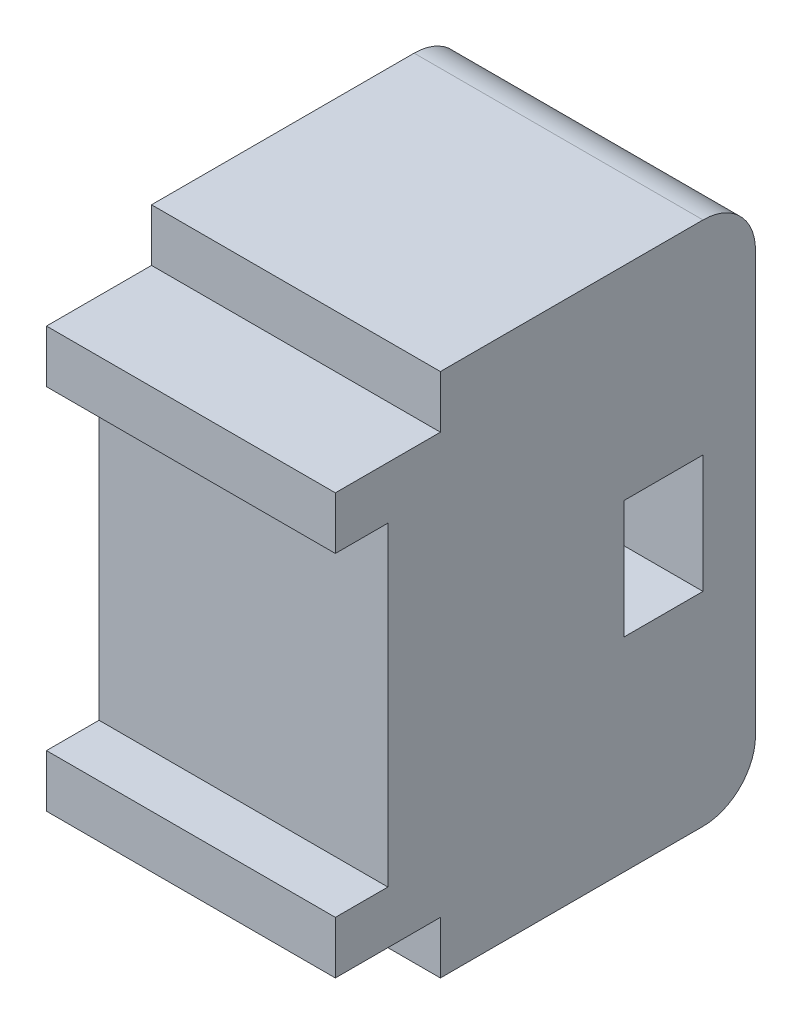
ISO-10303-21;
HEADER;
FILE_DESCRIPTION(('STEP AP214'),'2;1');
FILE_NAME('part.step','',(''),(''),'','','');
FILE_SCHEMA(('AUTOMOTIVE_DESIGN { 1 0 10303 214 1 1 1 1 }'));
ENDSEC;
DATA;
#1=APPLICATION_CONTEXT('core data for automotive mechanical design processes');
#2=APPLICATION_PROTOCOL_DEFINITION('international standard','automotive_design',2000,#1);
#3=PRODUCT_CONTEXT('',#1,'mechanical');
#4=PRODUCT('Part','Part','',(#3));
#5=PRODUCT_RELATED_PRODUCT_CATEGORY('part','',(#4));
#6=PRODUCT_DEFINITION_FORMATION('','',#4);
#7=PRODUCT_DEFINITION_CONTEXT('part definition',#1,'design');
#8=PRODUCT_DEFINITION('design','',#6,#7);
#9=PRODUCT_DEFINITION_SHAPE('','',#8);
#10=(LENGTH_UNIT() NAMED_UNIT(*) SI_UNIT(.MILLI.,.METRE.));
#11=(NAMED_UNIT(*) PLANE_ANGLE_UNIT() SI_UNIT($,.RADIAN.));
#12=(NAMED_UNIT(*) SI_UNIT($,.STERADIAN.) SOLID_ANGLE_UNIT());
#13=UNCERTAINTY_MEASURE_WITH_UNIT(LENGTH_MEASURE(1.E-05),#10,'distance_accuracy_value','');
#14=(GEOMETRIC_REPRESENTATION_CONTEXT(3) GLOBAL_UNCERTAINTY_ASSIGNED_CONTEXT((#13)) GLOBAL_UNIT_ASSIGNED_CONTEXT((#10,
#11,#12)) REPRESENTATION_CONTEXT('',''));
#15=CARTESIAN_POINT('',(0.,0.,0.));
#16=DIRECTION('',(0.,0.,1.));
#17=DIRECTION('',(1.,0.,0.));
#18=AXIS2_PLACEMENT_3D('',#15,#16,#17);
#19=CARTESIAN_POINT('',(11.,0.,0.));
#20=DIRECTION('',(1.,0.,0.));
#21=DIRECTION('',(0.,0.,-1.));
#22=AXIS2_PLACEMENT_3D('',#19,#20,#21);
#23=PLANE('',#22);
#24=DIRECTION('',(0.,1.,0.));
#25=VECTOR('',#24,1.);
#26=CARTESIAN_POINT('',(11.,-10.,-6.));
#27=LINE('',#26,#25);
#28=CARTESIAN_POINT('',(11.,-8.,-6.));
#29=VERTEX_POINT('',#28);
#30=CARTESIAN_POINT('',(11.,8.,-6.));
#31=VERTEX_POINT('',#30);
#32=EDGE_CURVE('E283',#29,#31,#27,.T.);
#33=ORIENTED_EDGE('',*,*,#32,.T.);
#34=CARTESIAN_POINT('',(11.,8.,-4.));
#35=DIRECTION('',(1.,0.,0.));
#36=DIRECTION('',(0.,0.,-1.));
#37=AXIS2_PLACEMENT_3D('',#34,#35,#36);
#38=CIRCLE('',#37,2.);
#39=CARTESIAN_POINT('',(11.,10.,-4.));
#40=VERTEX_POINT('',#39);
#41=EDGE_CURVE('E57',#31,#40,#38,.T.);
#42=ORIENTED_EDGE('',*,*,#41,.T.);
#43=DIRECTION('',(0.,0.,1.));
#44=VECTOR('',#43,1.);
#45=CARTESIAN_POINT('',(11.,10.,6.));
#46=LINE('',#45,#44);
#47=CARTESIAN_POINT('',(11.,10.,6.));
#48=VERTEX_POINT('',#47);
#49=EDGE_CURVE('E273',#40,#48,#46,.T.);
#50=ORIENTED_EDGE('',*,*,#49,.T.);
#51=DIRECTION('',(0.,-1.,0.));
#52=VECTOR('',#51,1.);
#53=CARTESIAN_POINT('',(11.,-10.,6.));
#54=LINE('',#53,#52);
#55=CARTESIAN_POINT('',(11.,8.,6.));
#56=VERTEX_POINT('',#55);
#57=EDGE_CURVE('E277',#48,#56,#54,.T.);
#58=ORIENTED_EDGE('',*,*,#57,.T.);
#59=DIRECTION('',(0.,0.,-1.));
#60=VECTOR('',#59,1.);
#61=CARTESIAN_POINT('',(11.,8.,7.99999999999998));
#62=LINE('',#61,#60);
#63=CARTESIAN_POINT('',(11.,8.,9.99999999999998));
#64=VERTEX_POINT('',#63);
#65=EDGE_CURVE('E260',#64,#56,#62,.T.);
#66=ORIENTED_EDGE('',*,*,#65,.F.);
#67=DIRECTION('',(0.,1.,0.));
#68=VECTOR('',#67,1.);
#69=CARTESIAN_POINT('',(11.,8.,9.99999999999998));
#70=LINE('',#69,#68);
#71=CARTESIAN_POINT('',(11.,6.,9.99999999999998));
#72=VERTEX_POINT('',#71);
#73=EDGE_CURVE('E182',#72,#64,#70,.T.);
#74=ORIENTED_EDGE('',*,*,#73,.F.);
#75=DIRECTION('',(0.,0.,-1.));
#76=VECTOR('',#75,1.);
#77=CARTESIAN_POINT('',(11.,6.,9.99999999999998));
#78=LINE('',#77,#76);
#79=CARTESIAN_POINT('',(11.,6.,7.99999999999998));
#80=VERTEX_POINT('',#79);
#81=EDGE_CURVE('E178',#72,#80,#78,.T.);
#82=ORIENTED_EDGE('',*,*,#81,.T.);
#83=DIRECTION('',(0.,1.,0.));
#84=VECTOR('',#83,1.);
#85=CARTESIAN_POINT('',(11.,-8.,7.99999999999998));
#86=LINE('',#85,#84);
#87=CARTESIAN_POINT('',(11.,-6.,7.99999999999998));
#88=VERTEX_POINT('',#87);
#89=EDGE_CURVE('E252',#88,#80,#86,.T.);
#90=ORIENTED_EDGE('',*,*,#89,.F.);
#91=DIRECTION('',(0.,0.,-1.));
#92=VECTOR('',#91,1.);
#93=CARTESIAN_POINT('',(11.,-6.,9.99999999999998));
#94=LINE('',#93,#92);
#95=CARTESIAN_POINT('',(11.,-6.,9.99999999999998));
#96=VERTEX_POINT('',#95);
#97=EDGE_CURVE('E206',#96,#88,#94,.T.);
#98=ORIENTED_EDGE('',*,*,#97,.F.);
#99=DIRECTION('',(0.,1.,0.));
#100=VECTOR('',#99,1.);
#101=CARTESIAN_POINT('',(11.,-6.,9.99999999999998));
#102=LINE('',#101,#100);
#103=CARTESIAN_POINT('',(11.,-8.,9.99999999999998));
#104=VERTEX_POINT('',#103);
#105=EDGE_CURVE('E213',#104,#96,#102,.T.);
#106=ORIENTED_EDGE('',*,*,#105,.F.);
#107=DIRECTION('',(0.,0.,-1.));
#108=VECTOR('',#107,1.);
#109=CARTESIAN_POINT('',(11.,-8.,7.99999999999998));
#110=LINE('',#109,#108);
#111=CARTESIAN_POINT('',(11.,-8.,6.));
#112=VERTEX_POINT('',#111);
#113=EDGE_CURVE('E263',#104,#112,#110,.T.);
#114=ORIENTED_EDGE('',*,*,#113,.T.);
#115=CARTESIAN_POINT('',(11.,-10.,6.));
#116=VERTEX_POINT('',#115);
#117=EDGE_CURVE('E275',#112,#116,#54,.T.);
#118=ORIENTED_EDGE('',*,*,#117,.T.);
#119=DIRECTION('',(0.,0.,-1.));
#120=VECTOR('',#119,1.);
#121=CARTESIAN_POINT('',(11.,-10.,6.));
#122=LINE('',#121,#120);
#123=CARTESIAN_POINT('',(11.,-10.,-4.));
#124=VERTEX_POINT('',#123);
#125=EDGE_CURVE('E280',#116,#124,#122,.T.);
#126=ORIENTED_EDGE('',*,*,#125,.T.);
#127=CARTESIAN_POINT('',(11.,-8.,-4.));
#128=DIRECTION('',(1.,0.,0.));
#129=DIRECTION('',(0.,0.,-1.));
#130=AXIS2_PLACEMENT_3D('',#127,#128,#129);
#131=CIRCLE('',#130,2.);
#132=EDGE_CURVE('E313',#124,#29,#131,.T.);
#133=ORIENTED_EDGE('',*,*,#132,.T.);
#134=EDGE_LOOP('',(#33,#42,#50,#58,#66,#74,#82,#90,#98,#106,#114,#118,#126,#133));
#135=FACE_BOUND('',#134,.T.);
#136=DIRECTION('',(0.,-1.,0.));
#137=VECTOR('',#136,1.);
#138=CARTESIAN_POINT('',(11.,0.,-4.));
#139=LINE('',#138,#137);
#140=CARTESIAN_POINT('',(11.,2.25,-4.));
#141=VERTEX_POINT('',#140);
#142=CARTESIAN_POINT('',(11.,-2.25,-4.));
#143=VERTEX_POINT('',#142);
#144=EDGE_CURVE('E246',#141,#143,#139,.T.);
#145=ORIENTED_EDGE('',*,*,#144,.T.);
#146=DIRECTION('',(0.,0.,1.));
#147=VECTOR('',#146,1.);
#148=CARTESIAN_POINT('',(11.,-2.25,0.));
#149=LINE('',#148,#147);
#150=CARTESIAN_POINT('',(11.,-2.25,-0.999999999999999));
#151=VERTEX_POINT('',#150);
#152=EDGE_CURVE('E249',#143,#151,#149,.T.);
#153=ORIENTED_EDGE('',*,*,#152,.T.);
#154=DIRECTION('',(0.,1.,0.));
#155=VECTOR('',#154,1.);
#156=CARTESIAN_POINT('',(11.,0.,-0.999999999999999));
#157=LINE('',#156,#155);
#158=CARTESIAN_POINT('',(11.,2.25,-0.999999999999999));
#159=VERTEX_POINT('',#158);
#160=EDGE_CURVE('E240',#151,#159,#157,.T.);
#161=ORIENTED_EDGE('',*,*,#160,.T.);
#162=DIRECTION('',(0.,0.,-1.));
#163=VECTOR('',#162,1.);
#164=CARTESIAN_POINT('',(11.,2.25,0.));
#165=LINE('',#164,#163);
#166=EDGE_CURVE('E243',#159,#141,#165,.T.);
#167=ORIENTED_EDGE('',*,*,#166,.T.);
#168=EDGE_LOOP('',(#145,#153,#161,#167));
#169=FACE_BOUND('',#168,.T.);
#170=ADVANCED_FACE('F49',(#135,#169),#23,.T.);
#171=CARTESIAN_POINT('',(0.,0.,0.));
#172=DIRECTION('',(1.,0.,0.));
#173=DIRECTION('',(0.,0.,-1.));
#174=AXIS2_PLACEMENT_3D('',#171,#172,#173);
#175=PLANE('',#174);
#176=DIRECTION('',(0.,0.,1.));
#177=VECTOR('',#176,1.);
#178=CARTESIAN_POINT('',(0.,10.,6.));
#179=LINE('',#178,#177);
#180=CARTESIAN_POINT('',(0.,10.,-4.));
#181=VERTEX_POINT('',#180);
#182=CARTESIAN_POINT('',(0.,10.,6.));
#183=VERTEX_POINT('',#182);
#184=EDGE_CURVE('E272',#181,#183,#179,.T.);
#185=ORIENTED_EDGE('',*,*,#184,.F.);
#186=CARTESIAN_POINT('',(0.,8.,-4.));
#187=DIRECTION('',(1.,0.,0.));
#188=DIRECTION('',(0.,0.,-1.));
#189=AXIS2_PLACEMENT_3D('',#186,#187,#188);
#190=CIRCLE('',#189,2.);
#191=CARTESIAN_POINT('',(0.,8.,-6.));
#192=VERTEX_POINT('',#191);
#193=EDGE_CURVE('E306',#181,#192,#190,.F.);
#194=ORIENTED_EDGE('',*,*,#193,.T.);
#195=DIRECTION('',(0.,1.,0.));
#196=VECTOR('',#195,1.);
#197=CARTESIAN_POINT('',(0.,-10.,-6.));
#198=LINE('',#197,#196);
#199=CARTESIAN_POINT('',(0.,-8.,-6.));
#200=VERTEX_POINT('',#199);
#201=EDGE_CURVE('E276',#200,#192,#198,.T.);
#202=ORIENTED_EDGE('',*,*,#201,.F.);
#203=CARTESIAN_POINT('',(0.,-8.,-4.));
#204=DIRECTION('',(1.,0.,0.));
#205=DIRECTION('',(0.,0.,-1.));
#206=AXIS2_PLACEMENT_3D('',#203,#204,#205);
#207=CIRCLE('',#206,2.);
#208=CARTESIAN_POINT('',(0.,-10.,-4.));
#209=VERTEX_POINT('',#208);
#210=EDGE_CURVE('E304',#200,#209,#207,.F.);
#211=ORIENTED_EDGE('',*,*,#210,.T.);
#212=DIRECTION('',(0.,0.,-1.));
#213=VECTOR('',#212,1.);
#214=CARTESIAN_POINT('',(0.,-10.,6.));
#215=LINE('',#214,#213);
#216=CARTESIAN_POINT('',(0.,-10.,6.));
#217=VERTEX_POINT('',#216);
#218=EDGE_CURVE('E291',#217,#209,#215,.T.);
#219=ORIENTED_EDGE('',*,*,#218,.F.);
#220=DIRECTION('',(0.,-1.,0.));
#221=VECTOR('',#220,1.);
#222=CARTESIAN_POINT('',(0.,-10.,6.));
#223=LINE('',#222,#221);
#224=CARTESIAN_POINT('',(0.,-8.,6.));
#225=VERTEX_POINT('',#224);
#226=EDGE_CURVE('E288',#225,#217,#223,.T.);
#227=ORIENTED_EDGE('',*,*,#226,.F.);
#228=DIRECTION('',(0.,0.,-1.));
#229=VECTOR('',#228,1.);
#230=CARTESIAN_POINT('',(0.,-8.,7.99999999999998));
#231=LINE('',#230,#229);
#232=CARTESIAN_POINT('',(0.,-8.,9.99999999999998));
#233=VERTEX_POINT('',#232);
#234=EDGE_CURVE('E255',#233,#225,#231,.T.);
#235=ORIENTED_EDGE('',*,*,#234,.F.);
#236=DIRECTION('',(0.,-1.,0.));
#237=VECTOR('',#236,1.);
#238=CARTESIAN_POINT('',(0.,-6.,9.99999999999998));
#239=LINE('',#238,#237);
#240=CARTESIAN_POINT('',(0.,-6.,9.99999999999998));
#241=VERTEX_POINT('',#240);
#242=EDGE_CURVE('E216',#241,#233,#239,.T.);
#243=ORIENTED_EDGE('',*,*,#242,.F.);
#244=DIRECTION('',(0.,0.,-1.));
#245=VECTOR('',#244,1.);
#246=CARTESIAN_POINT('',(0.,-6.,9.99999999999998));
#247=LINE('',#246,#245);
#248=CARTESIAN_POINT('',(0.,-6.,7.99999999999998));
#249=VERTEX_POINT('',#248);
#250=EDGE_CURVE('E209',#241,#249,#247,.T.);
#251=ORIENTED_EDGE('',*,*,#250,.T.);
#252=DIRECTION('',(0.,-1.,0.));
#253=VECTOR('',#252,1.);
#254=CARTESIAN_POINT('',(0.,-8.,7.99999999999998));
#255=LINE('',#254,#253);
#256=CARTESIAN_POINT('',(0.,6.,7.99999999999998));
#257=VERTEX_POINT('',#256);
#258=EDGE_CURVE('E197',#257,#249,#255,.T.);
#259=ORIENTED_EDGE('',*,*,#258,.F.);
#260=DIRECTION('',(0.,0.,-1.));
#261=VECTOR('',#260,1.);
#262=CARTESIAN_POINT('',(0.,6.,9.99999999999998));
#263=LINE('',#262,#261);
#264=CARTESIAN_POINT('',(0.,6.,9.99999999999998));
#265=VERTEX_POINT('',#264);
#266=EDGE_CURVE('E176',#265,#257,#263,.T.);
#267=ORIENTED_EDGE('',*,*,#266,.F.);
#268=DIRECTION('',(0.,-1.,0.));
#269=VECTOR('',#268,1.);
#270=CARTESIAN_POINT('',(0.,8.,9.99999999999998));
#271=LINE('',#270,#269);
#272=CARTESIAN_POINT('',(0.,8.,9.99999999999998));
#273=VERTEX_POINT('',#272);
#274=EDGE_CURVE('E183',#273,#265,#271,.T.);
#275=ORIENTED_EDGE('',*,*,#274,.F.);
#276=DIRECTION('',(0.,0.,-1.));
#277=VECTOR('',#276,1.);
#278=CARTESIAN_POINT('',(0.,8.,7.99999999999998));
#279=LINE('',#278,#277);
#280=CARTESIAN_POINT('',(0.,8.,6.));
#281=VERTEX_POINT('',#280);
#282=EDGE_CURVE('E258',#273,#281,#279,.T.);
#283=ORIENTED_EDGE('',*,*,#282,.T.);
#284=EDGE_CURVE('E289',#183,#281,#223,.T.);
#285=ORIENTED_EDGE('',*,*,#284,.F.);
#286=EDGE_LOOP('',(#185,#194,#202,#211,#219,#227,#235,#243,#251,#259,#267,#275,#283,#285));
#287=FACE_BOUND('',#286,.T.);
#288=DIRECTION('',(0.,0.,-1.));
#289=VECTOR('',#288,1.);
#290=CARTESIAN_POINT('',(0.,-2.25,-0.999999999999999));
#291=LINE('',#290,#289);
#292=CARTESIAN_POINT('',(0.,-2.25,-0.999999999999999));
#293=VERTEX_POINT('',#292);
#294=CARTESIAN_POINT('',(0.,-2.25,-4.));
#295=VERTEX_POINT('',#294);
#296=EDGE_CURVE('E198',#293,#295,#291,.T.);
#297=ORIENTED_EDGE('',*,*,#296,.T.);
#298=DIRECTION('',(0.,1.,0.));
#299=VECTOR('',#298,1.);
#300=CARTESIAN_POINT('',(0.,-2.25,-4.));
#301=LINE('',#300,#299);
#302=CARTESIAN_POINT('',(0.,2.25,-4.));
#303=VERTEX_POINT('',#302);
#304=EDGE_CURVE('E201',#295,#303,#301,.T.);
#305=ORIENTED_EDGE('',*,*,#304,.T.);
#306=DIRECTION('',(0.,0.,1.));
#307=VECTOR('',#306,1.);
#308=CARTESIAN_POINT('',(0.,2.25,-0.999999999999999));
#309=LINE('',#308,#307);
#310=CARTESIAN_POINT('',(0.,2.25,-0.999999999999999));
#311=VERTEX_POINT('',#310);
#312=EDGE_CURVE('E225',#303,#311,#309,.T.);
#313=ORIENTED_EDGE('',*,*,#312,.T.);
#314=DIRECTION('',(0.,-1.,0.));
#315=VECTOR('',#314,1.);
#316=CARTESIAN_POINT('',(0.,-2.25,-0.999999999999999));
#317=LINE('',#316,#315);
#318=EDGE_CURVE('E228',#311,#293,#317,.T.);
#319=ORIENTED_EDGE('',*,*,#318,.T.);
#320=EDGE_LOOP('',(#297,#305,#313,#319));
#321=FACE_BOUND('',#320,.T.);
#322=ADVANCED_FACE('F194',(#287,#321),#175,.F.);
#323=CARTESIAN_POINT('',(11.,-10.,6.));
#324=DIRECTION('',(0.,0.,-1.));
#325=DIRECTION('',(-1.,0.,0.));
#326=AXIS2_PLACEMENT_3D('',#323,#324,#325);
#327=PLANE('',#326);
#328=DIRECTION('',(1.,0.,0.));
#329=VECTOR('',#328,1.);
#330=CARTESIAN_POINT('',(11.,-8.,6.));
#331=LINE('',#330,#329);
#332=EDGE_CURVE('E269',#225,#112,#331,.T.);
#333=ORIENTED_EDGE('',*,*,#332,.F.);
#334=ORIENTED_EDGE('',*,*,#226,.T.);
#335=DIRECTION('',(-1.,0.,0.));
#336=VECTOR('',#335,1.);
#337=CARTESIAN_POINT('',(11.,-10.,6.));
#338=LINE('',#337,#336);
#339=EDGE_CURVE('E286',#116,#217,#338,.T.);
#340=ORIENTED_EDGE('',*,*,#339,.F.);
#341=ORIENTED_EDGE('',*,*,#117,.F.);
#342=EDGE_LOOP('',(#333,#334,#340,#341));
#343=FACE_BOUND('',#342,.T.);
#344=ADVANCED_FACE('F342',(#343),#327,.F.);
#345=DIRECTION('',(-1.,0.,0.));
#346=VECTOR('',#345,1.);
#347=CARTESIAN_POINT('',(11.,8.,6.));
#348=LINE('',#347,#346);
#349=EDGE_CURVE('E266',#56,#281,#348,.T.);
#350=ORIENTED_EDGE('',*,*,#349,.F.);
#351=ORIENTED_EDGE('',*,*,#57,.F.);
#352=DIRECTION('',(-1.,0.,0.));
#353=VECTOR('',#352,1.);
#354=CARTESIAN_POINT('',(11.,10.,6.));
#355=LINE('',#354,#353);
#356=EDGE_CURVE('E298',#48,#183,#355,.T.);
#357=ORIENTED_EDGE('',*,*,#356,.T.);
#358=ORIENTED_EDGE('',*,*,#284,.T.);
#359=EDGE_LOOP('',(#350,#351,#357,#358));
#360=FACE_BOUND('',#359,.T.);
#361=ADVANCED_FACE('F382',(#360),#327,.F.);
#362=CARTESIAN_POINT('',(11.,10.,6.));
#363=DIRECTION('',(0.,-1.,0.));
#364=DIRECTION('',(0.,0.,-1.));
#365=AXIS2_PLACEMENT_3D('',#362,#363,#364);
#366=PLANE('',#365);
#367=ORIENTED_EDGE('',*,*,#49,.F.);
#368=DIRECTION('',(-1.,0.,0.));
#369=VECTOR('',#368,1.);
#370=CARTESIAN_POINT('',(11.,10.,-4.));
#371=LINE('',#370,#369);
#372=EDGE_CURVE('E301',#40,#181,#371,.T.);
#373=ORIENTED_EDGE('',*,*,#372,.T.);
#374=ORIENTED_EDGE('',*,*,#184,.T.);
#375=ORIENTED_EDGE('',*,*,#356,.F.);
#376=EDGE_LOOP('',(#367,#373,#374,#375));
#377=FACE_BOUND('',#376,.T.);
#378=ADVANCED_FACE('F325',(#377),#366,.F.);
#379=CARTESIAN_POINT('',(11.,-10.,6.));
#380=DIRECTION('',(0.,1.,0.));
#381=DIRECTION('',(0.,0.,1.));
#382=AXIS2_PLACEMENT_3D('',#379,#380,#381);
#383=PLANE('',#382);
#384=ORIENTED_EDGE('',*,*,#218,.T.);
#385=DIRECTION('',(-1.,0.,0.));
#386=VECTOR('',#385,1.);
#387=CARTESIAN_POINT('',(11.,-10.,-4.));
#388=LINE('',#387,#386);
#389=EDGE_CURVE('E11',#209,#124,#388,.F.);
#390=ORIENTED_EDGE('',*,*,#389,.T.);
#391=ORIENTED_EDGE('',*,*,#125,.F.);
#392=ORIENTED_EDGE('',*,*,#339,.T.);
#393=EDGE_LOOP('',(#384,#390,#391,#392));
#394=FACE_BOUND('',#393,.T.);
#395=ADVANCED_FACE('F337',(#394),#383,.F.);
#396=CARTESIAN_POINT('',(11.,-10.,-6.));
#397=DIRECTION('',(0.,0.,1.));
#398=DIRECTION('',(1.,0.,0.));
#399=AXIS2_PLACEMENT_3D('',#396,#397,#398);
#400=PLANE('',#399);
#401=ORIENTED_EDGE('',*,*,#201,.T.);
#402=DIRECTION('',(-1.,0.,0.));
#403=VECTOR('',#402,1.);
#404=CARTESIAN_POINT('',(11.,8.,-6.));
#405=LINE('',#404,#403);
#406=EDGE_CURVE('E311',#192,#31,#405,.F.);
#407=ORIENTED_EDGE('',*,*,#406,.T.);
#408=ORIENTED_EDGE('',*,*,#32,.F.);
#409=DIRECTION('',(-1.,0.,0.));
#410=VECTOR('',#409,1.);
#411=CARTESIAN_POINT('',(11.,-8.,-6.));
#412=LINE('',#411,#410);
#413=EDGE_CURVE('E308',#29,#200,#412,.T.);
#414=ORIENTED_EDGE('',*,*,#413,.T.);
#415=EDGE_LOOP('',(#401,#407,#408,#414));
#416=FACE_BOUND('',#415,.T.);
#417=ADVANCED_FACE('F330',(#416),#400,.F.);
#418=CARTESIAN_POINT('',(0.,-8.,7.99999999999998));
#419=DIRECTION('',(0.,1.,0.));
#420=DIRECTION('',(0.,0.,1.));
#421=AXIS2_PLACEMENT_3D('',#418,#419,#420);
#422=PLANE('',#421);
#423=ORIENTED_EDGE('',*,*,#234,.T.);
#424=ORIENTED_EDGE('',*,*,#332,.T.);
#425=ORIENTED_EDGE('',*,*,#113,.F.);
#426=DIRECTION('',(1.,0.,0.));
#427=VECTOR('',#426,1.);
#428=CARTESIAN_POINT('',(0.,-8.,9.99999999999998));
#429=LINE('',#428,#427);
#430=EDGE_CURVE('E211',#233,#104,#429,.T.);
#431=ORIENTED_EDGE('',*,*,#430,.F.);
#432=EDGE_LOOP('',(#423,#424,#425,#431));
#433=FACE_BOUND('',#432,.T.);
#434=ADVANCED_FACE('F350',(#433),#422,.F.);
#435=CARTESIAN_POINT('',(0.,8.,7.99999999999998));
#436=DIRECTION('',(0.,-1.,0.));
#437=DIRECTION('',(1.,0.,0.));
#438=AXIS2_PLACEMENT_3D('',#435,#436,#437);
#439=PLANE('',#438);
#440=ORIENTED_EDGE('',*,*,#65,.T.);
#441=ORIENTED_EDGE('',*,*,#349,.T.);
#442=ORIENTED_EDGE('',*,*,#282,.F.);
#443=DIRECTION('',(-1.,0.,0.));
#444=VECTOR('',#443,1.);
#445=CARTESIAN_POINT('',(0.,8.,9.99999999999998));
#446=LINE('',#445,#444);
#447=EDGE_CURVE('E189',#64,#273,#446,.T.);
#448=ORIENTED_EDGE('',*,*,#447,.F.);
#449=EDGE_LOOP('',(#440,#441,#442,#448));
#450=FACE_BOUND('',#449,.T.);
#451=ADVANCED_FACE('F391',(#450),#439,.F.);
#452=CARTESIAN_POINT('',(0.,0.,7.99999999999998));
#453=DIRECTION('',(0.,0.,1.));
#454=DIRECTION('',(1.,0.,0.));
#455=AXIS2_PLACEMENT_3D('',#452,#453,#454);
#456=PLANE('',#455);
#457=DIRECTION('',(1.,0.,0.));
#458=VECTOR('',#457,1.);
#459=CARTESIAN_POINT('',(0.,6.,7.99999999999998));
#460=LINE('',#459,#458);
#461=EDGE_CURVE('E64',#257,#80,#460,.T.);
#462=ORIENTED_EDGE('',*,*,#461,.F.);
#463=ORIENTED_EDGE('',*,*,#258,.T.);
#464=DIRECTION('',(-1.,0.,0.));
#465=VECTOR('',#464,1.);
#466=CARTESIAN_POINT('',(0.,-6.,7.99999999999998));
#467=LINE('',#466,#465);
#468=EDGE_CURVE('E69',#88,#249,#467,.T.);
#469=ORIENTED_EDGE('',*,*,#468,.F.);
#470=ORIENTED_EDGE('',*,*,#89,.T.);
#471=EDGE_LOOP('',(#462,#463,#469,#470));
#472=FACE_BOUND('',#471,.T.);
#473=ADVANCED_FACE('F385',(#472),#456,.T.);
#474=CARTESIAN_POINT('',(11.,8.,-4.));
#475=DIRECTION('',(-1.,0.,0.));
#476=DIRECTION('',(0.,0.,1.));
#477=AXIS2_PLACEMENT_3D('',#474,#475,#476);
#478=CYLINDRICAL_SURFACE('',#477,2.);
#479=ORIENTED_EDGE('',*,*,#41,.F.);
#480=ORIENTED_EDGE('',*,*,#406,.F.);
#481=ORIENTED_EDGE('',*,*,#193,.F.);
#482=ORIENTED_EDGE('',*,*,#372,.F.);
#483=EDGE_LOOP('',(#479,#480,#481,#482));
#484=FACE_BOUND('',#483,.T.);
#485=ADVANCED_FACE('F326',(#484),#478,.T.);
#486=CARTESIAN_POINT('',(11.,-8.,-4.));
#487=DIRECTION('',(-1.,0.,0.));
#488=DIRECTION('',(0.,0.,1.));
#489=AXIS2_PLACEMENT_3D('',#486,#487,#488);
#490=CYLINDRICAL_SURFACE('',#489,2.);
#491=ORIENTED_EDGE('',*,*,#132,.F.);
#492=ORIENTED_EDGE('',*,*,#389,.F.);
#493=ORIENTED_EDGE('',*,*,#210,.F.);
#494=ORIENTED_EDGE('',*,*,#413,.F.);
#495=EDGE_LOOP('',(#491,#492,#493,#494));
#496=FACE_BOUND('',#495,.T.);
#497=ADVANCED_FACE('F51',(#496),#490,.T.);
#498=CARTESIAN_POINT('',(15.,-2.25,-0.999999999999999));
#499=DIRECTION('',(0.,1.,0.));
#500=DIRECTION('',(0.,0.,1.));
#501=AXIS2_PLACEMENT_3D('',#498,#499,#500);
#502=PLANE('',#501);
#503=DIRECTION('',(-1.,0.,0.));
#504=VECTOR('',#503,1.);
#505=CARTESIAN_POINT('',(15.,-2.25,-4.));
#506=LINE('',#505,#504);
#507=EDGE_CURVE('E238',#143,#295,#506,.T.);
#508=ORIENTED_EDGE('',*,*,#507,.T.);
#509=ORIENTED_EDGE('',*,*,#296,.F.);
#510=DIRECTION('',(-1.,0.,0.));
#511=VECTOR('',#510,1.);
#512=CARTESIAN_POINT('',(15.,-2.25,-0.999999999999999));
#513=LINE('',#512,#511);
#514=EDGE_CURVE('E231',#151,#293,#513,.T.);
#515=ORIENTED_EDGE('',*,*,#514,.F.);
#516=ORIENTED_EDGE('',*,*,#152,.F.);
#517=EDGE_LOOP('',(#508,#509,#515,#516));
#518=FACE_BOUND('',#517,.T.);
#519=ADVANCED_FACE('F390',(#518),#502,.T.);
#520=CARTESIAN_POINT('',(15.,-2.25,-4.));
#521=DIRECTION('',(0.,0.,1.));
#522=DIRECTION('',(1.,0.,0.));
#523=AXIS2_PLACEMENT_3D('',#520,#521,#522);
#524=PLANE('',#523);
#525=DIRECTION('',(-1.,0.,0.));
#526=VECTOR('',#525,1.);
#527=CARTESIAN_POINT('',(15.,2.25,-4.));
#528=LINE('',#527,#526);
#529=EDGE_CURVE('E236',#141,#303,#528,.T.);
#530=ORIENTED_EDGE('',*,*,#529,.T.);
#531=ORIENTED_EDGE('',*,*,#304,.F.);
#532=ORIENTED_EDGE('',*,*,#507,.F.);
#533=ORIENTED_EDGE('',*,*,#144,.F.);
#534=EDGE_LOOP('',(#530,#531,#532,#533));
#535=FACE_BOUND('',#534,.T.);
#536=ADVANCED_FACE('F400',(#535),#524,.T.);
#537=CARTESIAN_POINT('',(15.,2.25,-0.999999999999999));
#538=DIRECTION('',(0.,-1.,0.));
#539=DIRECTION('',(0.,0.,-1.));
#540=AXIS2_PLACEMENT_3D('',#537,#538,#539);
#541=PLANE('',#540);
#542=DIRECTION('',(-1.,0.,0.));
#543=VECTOR('',#542,1.);
#544=CARTESIAN_POINT('',(15.,2.25,-0.999999999999999));
#545=LINE('',#544,#543);
#546=EDGE_CURVE('E234',#159,#311,#545,.T.);
#547=ORIENTED_EDGE('',*,*,#546,.T.);
#548=ORIENTED_EDGE('',*,*,#312,.F.);
#549=ORIENTED_EDGE('',*,*,#529,.F.);
#550=ORIENTED_EDGE('',*,*,#166,.F.);
#551=EDGE_LOOP('',(#547,#548,#549,#550));
#552=FACE_BOUND('',#551,.T.);
#553=ADVANCED_FACE('F363',(#552),#541,.T.);
#554=CARTESIAN_POINT('',(15.,-2.25,-0.999999999999999));
#555=DIRECTION('',(0.,0.,-1.));
#556=DIRECTION('',(-1.,0.,0.));
#557=AXIS2_PLACEMENT_3D('',#554,#555,#556);
#558=PLANE('',#557);
#559=ORIENTED_EDGE('',*,*,#514,.T.);
#560=ORIENTED_EDGE('',*,*,#318,.F.);
#561=ORIENTED_EDGE('',*,*,#546,.F.);
#562=ORIENTED_EDGE('',*,*,#160,.F.);
#563=EDGE_LOOP('',(#559,#560,#561,#562));
#564=FACE_BOUND('',#563,.T.);
#565=ADVANCED_FACE('F355',(#564),#558,.T.);
#566=CARTESIAN_POINT('',(0.,-6.,9.99999999999998));
#567=DIRECTION('',(0.,-1.,0.));
#568=DIRECTION('',(0.,0.,-1.));
#569=AXIS2_PLACEMENT_3D('',#566,#567,#568);
#570=PLANE('',#569);
#571=ORIENTED_EDGE('',*,*,#468,.T.);
#572=ORIENTED_EDGE('',*,*,#250,.F.);
#573=DIRECTION('',(-1.,0.,0.));
#574=VECTOR('',#573,1.);
#575=CARTESIAN_POINT('',(0.,-6.,9.99999999999998));
#576=LINE('',#575,#574);
#577=EDGE_CURVE('E219',#96,#241,#576,.T.);
#578=ORIENTED_EDGE('',*,*,#577,.F.);
#579=ORIENTED_EDGE('',*,*,#97,.T.);
#580=EDGE_LOOP('',(#571,#572,#578,#579));
#581=FACE_BOUND('',#580,.T.);
#582=ADVANCED_FACE('F353',(#581),#570,.F.);
#583=CARTESIAN_POINT('',(0.,0.,9.99999999999998));
#584=DIRECTION('',(0.,0.,1.));
#585=DIRECTION('',(1.,0.,0.));
#586=AXIS2_PLACEMENT_3D('',#583,#584,#585);
#587=PLANE('',#586);
#588=ORIENTED_EDGE('',*,*,#105,.T.);
#589=ORIENTED_EDGE('',*,*,#577,.T.);
#590=ORIENTED_EDGE('',*,*,#242,.T.);
#591=ORIENTED_EDGE('',*,*,#430,.T.);
#592=EDGE_LOOP('',(#588,#589,#590,#591));
#593=FACE_BOUND('',#592,.T.);
#594=ADVANCED_FACE('F347',(#593),#587,.T.);
#595=CARTESIAN_POINT('',(0.,6.,9.99999999999998));
#596=DIRECTION('',(0.,1.,0.));
#597=DIRECTION('',(0.,0.,1.));
#598=AXIS2_PLACEMENT_3D('',#595,#596,#597);
#599=PLANE('',#598);
#600=ORIENTED_EDGE('',*,*,#461,.T.);
#601=ORIENTED_EDGE('',*,*,#81,.F.);
#602=DIRECTION('',(1.,0.,0.));
#603=VECTOR('',#602,1.);
#604=CARTESIAN_POINT('',(0.,6.,9.99999999999998));
#605=LINE('',#604,#603);
#606=EDGE_CURVE('E172',#265,#72,#605,.T.);
#607=ORIENTED_EDGE('',*,*,#606,.F.);
#608=ORIENTED_EDGE('',*,*,#266,.T.);
#609=EDGE_LOOP('',(#600,#601,#607,#608));
#610=FACE_BOUND('',#609,.T.);
#611=ADVANCED_FACE('F174',(#610),#599,.F.);
#612=CARTESIAN_POINT('',(0.,0.,9.99999999999998));
#613=DIRECTION('',(0.,0.,1.));
#614=DIRECTION('',(1.,0.,0.));
#615=AXIS2_PLACEMENT_3D('',#612,#613,#614);
#616=PLANE('',#615);
#617=ORIENTED_EDGE('',*,*,#274,.T.);
#618=ORIENTED_EDGE('',*,*,#606,.T.);
#619=ORIENTED_EDGE('',*,*,#73,.T.);
#620=ORIENTED_EDGE('',*,*,#447,.T.);
#621=EDGE_LOOP('',(#617,#618,#619,#620));
#622=FACE_BOUND('',#621,.T.);
#623=ADVANCED_FACE('F187',(#622),#616,.T.);
#624=CLOSED_SHELL('',(#170,#322,#344,#361,#378,#395,#417,#434,#451,#473,#485,#497,#519,#536,
#553,#565,#582,#594,#611,#623));
#625=MANIFOLD_SOLID_BREP('B2',#624);
#626=ADVANCED_BREP_SHAPE_REPRESENTATION('',(#18,#625),#14);
#627=SHAPE_DEFINITION_REPRESENTATION(#9,#626);
ENDSEC;
END-ISO-10303-21;
